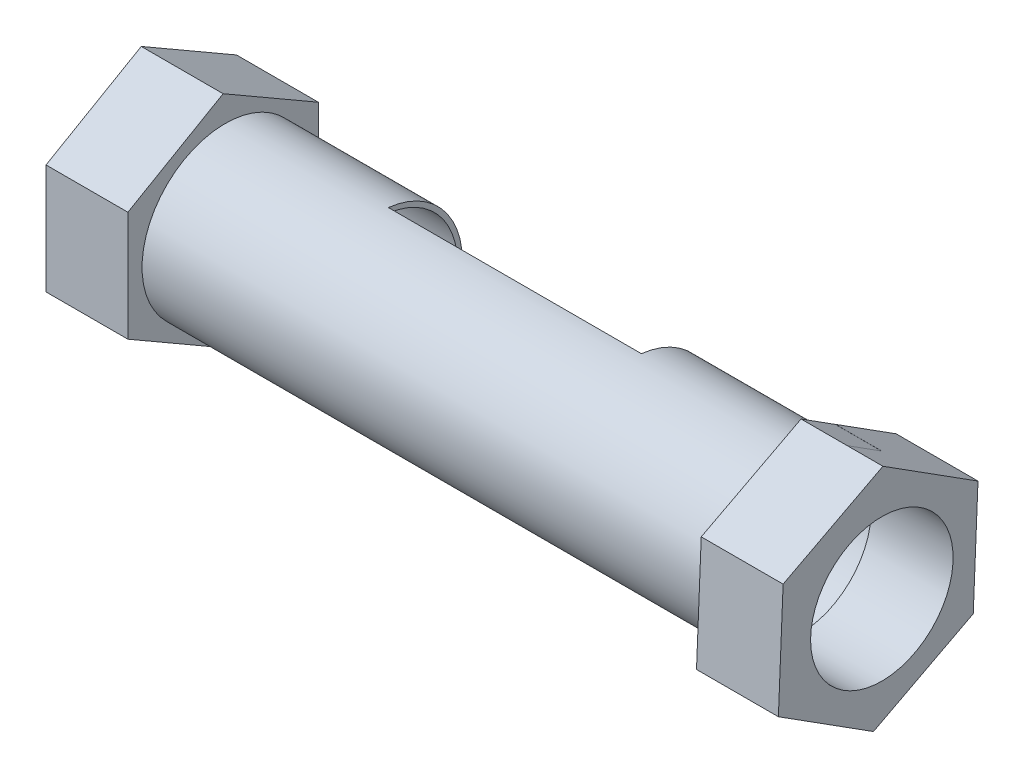
ISO-10303-21;
HEADER;
FILE_DESCRIPTION(('STEP AP214'),'2;1');
FILE_NAME('part.step','',(''),(''),'','','');
FILE_SCHEMA(('AUTOMOTIVE_DESIGN { 1 0 10303 214 1 1 1 1 }'));
ENDSEC;
DATA;
#1=APPLICATION_CONTEXT('core data for automotive mechanical design processes');
#2=APPLICATION_PROTOCOL_DEFINITION('international standard','automotive_design',2000,#1);
#3=PRODUCT_CONTEXT('',#1,'mechanical');
#4=PRODUCT('Part','Part','',(#3));
#5=PRODUCT_RELATED_PRODUCT_CATEGORY('part','',(#4));
#6=PRODUCT_DEFINITION_FORMATION('','',#4);
#7=PRODUCT_DEFINITION_CONTEXT('part definition',#1,'design');
#8=PRODUCT_DEFINITION('design','',#6,#7);
#9=PRODUCT_DEFINITION_SHAPE('','',#8);
#10=(LENGTH_UNIT() NAMED_UNIT(*) SI_UNIT(.MILLI.,.METRE.));
#11=(NAMED_UNIT(*) PLANE_ANGLE_UNIT() SI_UNIT($,.RADIAN.));
#12=(NAMED_UNIT(*) SI_UNIT($,.STERADIAN.) SOLID_ANGLE_UNIT());
#13=UNCERTAINTY_MEASURE_WITH_UNIT(LENGTH_MEASURE(1.E-05),#10,'distance_accuracy_value','');
#14=(GEOMETRIC_REPRESENTATION_CONTEXT(3) GLOBAL_UNCERTAINTY_ASSIGNED_CONTEXT((#13)) GLOBAL_UNIT_ASSIGNED_CONTEXT((#10,
#11,#12)) REPRESENTATION_CONTEXT('',''));
#15=CARTESIAN_POINT('',(0.,0.,0.));
#16=DIRECTION('',(0.,0.,1.));
#17=DIRECTION('',(1.,0.,0.));
#18=AXIS2_PLACEMENT_3D('',#15,#16,#17);
#19=CARTESIAN_POINT('',(400.,31.8499448364857,-60.9455307760078));
#20=DIRECTION('',(0.,-0.844247754451111,0.535953103456129));
#21=DIRECTION('',(0.,-0.535953103456129,-0.844247754451111));
#22=AXIS2_PLACEMENT_3D('',#19,#20,#21);
#23=PLANE('',#22);
#24=DIRECTION('',(0.,0.535953103456129,0.844247754451111));
#25=VECTOR('',#24,1.);
#26=CARTESIAN_POINT('',(350.,31.8499448364857,-60.9455307760078));
#27=LINE('',#26,#25);
#28=CARTESIAN_POINT('',(350.,31.8499448364857,-60.9455307760078));
#29=VERTEX_POINT('',#28);
#30=CARTESIAN_POINT('',(350.,55.3489186523933,-23.9293147152131));
#31=VERTEX_POINT('',#30);
#32=EDGE_CURVE('E285',#29,#31,#27,.T.);
#33=ORIENTED_EDGE('',*,*,#32,.T.);
#34=DIRECTION('',(1.,0.,0.));
#35=VECTOR('',#34,1.);
#36=CARTESIAN_POINT('',(400.,55.3489186523933,-23.9293147152131));
#37=LINE('',#36,#35);
#38=CARTESIAN_POINT('',(378.262248724972,55.3489186523933,-23.9293147152131));
#39=VERTEX_POINT('',#38);
#40=EDGE_CURVE('E186',#31,#39,#37,.T.);
#41=ORIENTED_EDGE('',*,*,#40,.T.);
#42=DIRECTION('',(0.,-0.535953103456129,-0.844247754451111));
#43=VECTOR('',#42,1.);
#44=CARTESIAN_POINT('',(378.262248724972,55.4173727829504,-23.8214839262261));
#45=LINE('',#44,#43);
#46=CARTESIAN_POINT('',(378.262248724972,68.7053503173919,-2.88990405047429));
#47=VERTEX_POINT('',#46);
#48=EDGE_CURVE('E180',#47,#39,#45,.T.);
#49=ORIENTED_EDGE('',*,*,#48,.F.);
#50=DIRECTION('',(-1.,0.,0.));
#51=VECTOR('',#50,1.);
#52=CARTESIAN_POINT('',(400.,68.7053503173919,-2.88990405047429));
#53=LINE('',#52,#51);
#54=CARTESIAN_POINT('',(400.,68.7053503173919,-2.88990405047429));
#55=VERTEX_POINT('',#54);
#56=EDGE_CURVE('E301',#55,#47,#53,.T.);
#57=ORIENTED_EDGE('',*,*,#56,.F.);
#58=DIRECTION('',(0.,0.535953103456129,0.844247754451111));
#59=VECTOR('',#58,1.);
#60=CARTESIAN_POINT('',(400.,31.8499448364857,-60.9455307760078));
#61=LINE('',#60,#59);
#62=CARTESIAN_POINT('',(400.,31.8499448364857,-60.9455307760078));
#63=VERTEX_POINT('',#62);
#64=EDGE_CURVE('E271',#63,#55,#61,.T.);
#65=ORIENTED_EDGE('',*,*,#64,.F.);
#66=DIRECTION('',(-1.,0.,0.));
#67=VECTOR('',#66,1.);
#68=CARTESIAN_POINT('',(400.,31.8499448364857,-60.9455307760078));
#69=LINE('',#68,#67);
#70=EDGE_CURVE('E304',#63,#29,#69,.T.);
#71=ORIENTED_EDGE('',*,*,#70,.T.);
#72=EDGE_LOOP('',(#33,#41,#49,#57,#65,#71));
#73=FACE_BOUND('',#72,.T.);
#74=ADVANCED_FACE('F34',(#73),#23,.F.);
#75=CARTESIAN_POINT('',(350.,0.,-1.28970231793346));
#76=DIRECTION('',(-1.,0.,0.));
#77=DIRECTION('',(0.,0.,1.));
#78=AXIS2_PLACEMENT_3D('',#75,#76,#77);
#79=CYLINDRICAL_SURFACE('',#78,50.8003751134074);
#80=DIRECTION('',(-1.,0.,0.));
#81=VECTOR('',#80,1.);
#82=CARTESIAN_POINT('',(350.,-50.4881730172019,-6.91309071355262));
#83=LINE('',#82,#81);
#84=CARTESIAN_POINT('',(93.9667928635855,-50.4881730172019,-6.91309071355262));
#85=VERTEX_POINT('',#84);
#86=CARTESIAN_POINT('',(248.52238004746,-50.4881730172019,-6.91309071355262));
#87=VERTEX_POINT('',#86);
#88=EDGE_CURVE('E198',#85,#87,#83,.F.);
#89=ORIENTED_EDGE('',*,*,#88,.T.);
#90=CARTESIAN_POINT('',(248.52238004746,0.,-1.28970231793346));
#91=DIRECTION('',(1.,0.,0.));
#92=DIRECTION('',(0.,0.,-1.));
#93=AXIS2_PLACEMENT_3D('',#90,#91,#92);
#94=CIRCLE('',#93,50.8003751134074);
#95=CARTESIAN_POINT('',(248.52238004746,50.4881730172019,-6.91309071355262));
#96=VERTEX_POINT('',#95);
#97=EDGE_CURVE('E204',#87,#96,#94,.T.);
#98=ORIENTED_EDGE('',*,*,#97,.T.);
#99=DIRECTION('',(-1.,0.,0.));
#100=VECTOR('',#99,1.);
#101=CARTESIAN_POINT('',(350.,50.4881730172019,-6.91309071355262));
#102=LINE('',#101,#100);
#103=CARTESIAN_POINT('',(93.9667928635855,50.4881730172019,-6.91309071355262));
#104=VERTEX_POINT('',#103);
#105=EDGE_CURVE('E201',#96,#104,#102,.T.);
#106=ORIENTED_EDGE('',*,*,#105,.T.);
#107=CARTESIAN_POINT('',(93.9667928635855,0.,-1.28970231793346));
#108=DIRECTION('',(-1.,0.,0.));
#109=DIRECTION('',(0.,0.,1.));
#110=AXIS2_PLACEMENT_3D('',#107,#108,#109);
#111=CIRCLE('',#110,50.8003751134074);
#112=EDGE_CURVE('E195',#104,#85,#111,.T.);
#113=ORIENTED_EDGE('',*,*,#112,.T.);
#114=EDGE_LOOP('',(#89,#98,#106,#113));
#115=FACE_BOUND('',#114,.T.);
#116=CARTESIAN_POINT('',(350.,0.,-1.28970231793346));
#117=DIRECTION('',(1.,0.,0.));
#118=DIRECTION('',(0.,0.,-1.));
#119=AXIS2_PLACEMENT_3D('',#116,#117,#118);
#120=CIRCLE('',#119,50.8003751134074);
#121=CARTESIAN_POINT('',(350.,0.,-52.0900774313409));
#122=VERTEX_POINT('',#121);
#123=EDGE_CURVE('E316',#122,#122,#120,.T.);
#124=ORIENTED_EDGE('',*,*,#123,.F.);
#125=EDGE_LOOP('',(#124));
#126=FACE_BOUND('',#125,.T.);
#127=CARTESIAN_POINT('',(0.,0.,-1.28970231793346));
#128=DIRECTION('',(1.,0.,0.));
#129=DIRECTION('',(0.,0.,-1.));
#130=AXIS2_PLACEMENT_3D('',#127,#128,#129);
#131=CIRCLE('',#130,50.8003751134074);
#132=CARTESIAN_POINT('',(0.,0.,-52.0900774313409));
#133=VERTEX_POINT('',#132);
#134=EDGE_CURVE('E264',#133,#133,#131,.T.);
#135=ORIENTED_EDGE('',*,*,#134,.T.);
#136=EDGE_LOOP('',(#135));
#137=FACE_BOUND('',#136,.T.);
#138=ADVANCED_FACE('F36',(#115,#126,#137),#79,.T.);
#139=CARTESIAN_POINT('',(350.,0.,-1.28970231793346));
#140=DIRECTION('',(-1.,0.,0.));
#141=DIRECTION('',(0.,0.,1.));
#142=AXIS2_PLACEMENT_3D('',#139,#140,#141);
#143=CYLINDRICAL_SURFACE('',#142,47.812951640793);
#144=CARTESIAN_POINT('',(248.52238004746,0.,-1.28970231793346));
#145=DIRECTION('',(1.,0.,0.));
#146=DIRECTION('',(0.,0.,-1.));
#147=AXIS2_PLACEMENT_3D('',#144,#145,#146);
#148=CIRCLE('',#147,47.812951640793);
#149=CARTESIAN_POINT('',(248.52238004746,-47.4811104288518,-6.91309071355262));
#150=VERTEX_POINT('',#149);
#151=CARTESIAN_POINT('',(248.52238004746,47.4811104288518,-6.91309071355262));
#152=VERTEX_POINT('',#151);
#153=EDGE_CURVE('E328',#150,#152,#148,.T.);
#154=ORIENTED_EDGE('',*,*,#153,.F.);
#155=DIRECTION('',(-1.,0.,0.));
#156=VECTOR('',#155,1.);
#157=CARTESIAN_POINT('',(350.,-47.4811104288518,-6.91309071355262));
#158=LINE('',#157,#156);
#159=CARTESIAN_POINT('',(93.9667928635855,-47.4811104288518,-6.91309071355262));
#160=VERTEX_POINT('',#159);
#161=EDGE_CURVE('E323',#160,#150,#158,.F.);
#162=ORIENTED_EDGE('',*,*,#161,.F.);
#163=CARTESIAN_POINT('',(93.9667928635855,0.,-1.28970231793346));
#164=DIRECTION('',(-1.,0.,0.));
#165=DIRECTION('',(0.,0.,1.));
#166=AXIS2_PLACEMENT_3D('',#163,#164,#165);
#167=CIRCLE('',#166,47.812951640793);
#168=CARTESIAN_POINT('',(93.9667928635855,47.4811104288518,-6.91309071355262));
#169=VERTEX_POINT('',#168);
#170=EDGE_CURVE('E319',#169,#160,#167,.T.);
#171=ORIENTED_EDGE('',*,*,#170,.F.);
#172=DIRECTION('',(-1.,0.,0.));
#173=VECTOR('',#172,1.);
#174=CARTESIAN_POINT('',(350.,47.4811104288518,-6.91309071355262));
#175=LINE('',#174,#173);
#176=EDGE_CURVE('E325',#152,#169,#175,.T.);
#177=ORIENTED_EDGE('',*,*,#176,.F.);
#178=EDGE_LOOP('',(#154,#162,#171,#177));
#179=FACE_BOUND('',#178,.T.);
#180=CARTESIAN_POINT('',(350.,0.,-1.28970231793346));
#181=DIRECTION('',(1.,0.,0.));
#182=DIRECTION('',(0.,0.,-1.));
#183=AXIS2_PLACEMENT_3D('',#180,#181,#182);
#184=CIRCLE('',#183,47.812951640793);
#185=CARTESIAN_POINT('',(350.,0.,-49.1026539587264));
#186=VERTEX_POINT('',#185);
#187=EDGE_CURVE('E310',#186,#186,#184,.T.);
#188=ORIENTED_EDGE('',*,*,#187,.T.);
#189=EDGE_LOOP('',(#188));
#190=FACE_BOUND('',#189,.T.);
#191=CARTESIAN_POINT('',(0.,0.,-1.28970231793346));
#192=DIRECTION('',(1.,0.,0.));
#193=DIRECTION('',(0.,0.,-1.));
#194=AXIS2_PLACEMENT_3D('',#191,#192,#193);
#195=CIRCLE('',#194,47.812951640793);
#196=CARTESIAN_POINT('',(0.,0.,-49.1026539587264));
#197=VERTEX_POINT('',#196);
#198=EDGE_CURVE('E313',#197,#197,#195,.T.);
#199=ORIENTED_EDGE('',*,*,#198,.F.);
#200=EDGE_LOOP('',(#199));
#201=FACE_BOUND('',#200,.T.);
#202=ADVANCED_FACE('F375',(#179,#190,#201),#143,.F.);
#203=CARTESIAN_POINT('',(350.,0.,0.));
#204=DIRECTION('',(1.,0.,0.));
#205=DIRECTION('',(0.,0.,-1.));
#206=AXIS2_PLACEMENT_3D('',#203,#204,#205);
#207=PLANE('',#206);
#208=CARTESIAN_POINT('',(350.,-1.09442531969695,-2.23147845243465));
#209=DIRECTION('',(-1.,0.,0.));
#210=DIRECTION('',(0.,0.,1.));
#211=AXIS2_PLACEMENT_3D('',#208,#209,#210);
#212=CIRCLE('',#211,43.5178984979552);
#213=CARTESIAN_POINT('',(350.,-1.09442531969695,41.2864200455205));
#214=VERTEX_POINT('',#213);
#215=EDGE_CURVE('E208',#214,#214,#212,.T.);
#216=ORIENTED_EDGE('',*,*,#215,.F.);
#217=EDGE_LOOP('',(#216));
#218=FACE_BOUND('',#217,.T.);
#219=ORIENTED_EDGE('',*,*,#187,.F.);
#220=EDGE_LOOP('',(#219));
#221=FACE_BOUND('',#220,.T.);
#222=ADVANCED_FACE('F369',(#218,#221),#207,.F.);
#223=CARTESIAN_POINT('',(400.,0.,0.));
#224=DIRECTION('',(1.,0.,0.));
#225=DIRECTION('',(0.,0.,-1.));
#226=AXIS2_PLACEMENT_3D('',#223,#224,#225);
#227=PLANE('',#226);
#228=CARTESIAN_POINT('',(400.,-1.09442531969695,-2.23147845243465));
#229=DIRECTION('',(-1.,0.,0.));
#230=DIRECTION('',(0.,0.,1.));
#231=AXIS2_PLACEMENT_3D('',#228,#229,#230);
#232=CIRCLE('',#231,43.5178984979552);
#233=CARTESIAN_POINT('',(400.,-1.09442531969695,41.2864200455205));
#234=VERTEX_POINT('',#233);
#235=EDGE_CURVE('E209',#234,#234,#232,.T.);
#236=ORIENTED_EDGE('',*,*,#235,.T.);
#237=EDGE_LOOP('',(#236));
#238=FACE_BOUND('',#237,.T.);
#239=DIRECTION('',(0.,0.463163450714565,-0.886272880055673));
#240=VECTOR('',#239,1.);
#241=CARTESIAN_POINT('',(400.,-68.7053503173919,2.88990405047424));
#242=LINE('',#241,#240);
#243=CARTESIAN_POINT('',(400.,-68.7053503173919,2.88990405047424));
#244=VERTEX_POINT('',#243);
#245=CARTESIAN_POINT('',(400.,-36.8554054809062,-58.0556267255335));
#246=VERTEX_POINT('',#245);
#247=EDGE_CURVE('E265',#244,#246,#242,.T.);
#248=ORIENTED_EDGE('',*,*,#247,.T.);
#249=DIRECTION('',(0.,0.999116554170694,-0.0420251256045614));
#250=VECTOR('',#249,1.);
#251=CARTESIAN_POINT('',(400.,-36.8554054809062,-58.0556267255335));
#252=LINE('',#251,#250);
#253=EDGE_CURVE('E268',#246,#63,#252,.T.);
#254=ORIENTED_EDGE('',*,*,#253,.T.);
#255=ORIENTED_EDGE('',*,*,#64,.T.);
#256=DIRECTION('',(0.,-0.463163450714565,0.886272880055673));
#257=VECTOR('',#256,1.);
#258=CARTESIAN_POINT('',(400.,68.7053503173919,-2.88990405047429));
#259=LINE('',#258,#257);
#260=CARTESIAN_POINT('',(400.,36.8554054809062,58.0556267255335));
#261=VERTEX_POINT('',#260);
#262=EDGE_CURVE('E273',#55,#261,#259,.T.);
#263=ORIENTED_EDGE('',*,*,#262,.T.);
#264=DIRECTION('',(0.,-0.999116554170694,0.0420251256045615));
#265=VECTOR('',#264,1.);
#266=CARTESIAN_POINT('',(400.,36.8554054809062,58.0556267255335));
#267=LINE('',#266,#265);
#268=CARTESIAN_POINT('',(400.,-31.8499448364857,60.9455307760078));
#269=VERTEX_POINT('',#268);
#270=EDGE_CURVE('E275',#261,#269,#267,.T.);
#271=ORIENTED_EDGE('',*,*,#270,.T.);
#272=DIRECTION('',(0.,-0.535953103456129,-0.844247754451111));
#273=VECTOR('',#272,1.);
#274=CARTESIAN_POINT('',(400.,-31.8499448364857,60.9455307760078));
#275=LINE('',#274,#273);
#276=EDGE_CURVE('E277',#269,#244,#275,.T.);
#277=ORIENTED_EDGE('',*,*,#276,.T.);
#278=EDGE_LOOP('',(#248,#254,#255,#263,#271,#277));
#279=FACE_BOUND('',#278,.T.);
#280=ADVANCED_FACE('F348',(#238,#279),#227,.T.);
#281=ORIENTED_EDGE('',*,*,#123,.T.);
#282=EDGE_LOOP('',(#281));
#283=FACE_BOUND('',#282,.T.);
#284=DIRECTION('',(0.,-0.537261503485051,-0.843415720076987));
#285=VECTOR('',#284,1.);
#286=CARTESIAN_POINT('',(350.,50.1811219008985,-31.9657131794774));
#287=LINE('',#286,#285);
#288=CARTESIAN_POINT('',(350.,68.7041146509274,-2.88753957703715));
#289=VERTEX_POINT('',#288);
#290=CARTESIAN_POINT('',(350.,55.3160398553878,-23.9047028594959));
#291=VERTEX_POINT('',#290);
#292=EDGE_CURVE('E184',#289,#291,#287,.T.);
#293=ORIENTED_EDGE('',*,*,#292,.T.);
#294=DIRECTION('',(0.,0.800551793849256,-0.599263569195341));
#295=VECTOR('',#294,1.);
#296=CARTESIAN_POINT('',(350.,8.39684201277107,11.2172794769066));
#297=LINE('',#296,#295);
#298=EDGE_CURVE('E11',#291,#31,#297,.T.);
#299=ORIENTED_EDGE('',*,*,#298,.T.);
#300=ORIENTED_EDGE('',*,*,#32,.F.);
#301=DIRECTION('',(0.,0.999116554170694,-0.0420251256045614));
#302=VECTOR('',#301,1.);
#303=CARTESIAN_POINT('',(350.,-36.8554054809062,-58.0556267255335));
#304=LINE('',#303,#302);
#305=CARTESIAN_POINT('',(350.,-36.8554054809062,-58.0556267255335));
#306=VERTEX_POINT('',#305);
#307=EDGE_CURVE('E283',#306,#29,#304,.T.);
#308=ORIENTED_EDGE('',*,*,#307,.F.);
#309=DIRECTION('',(0.,0.463163450714565,-0.886272880055673));
#310=VECTOR('',#309,1.);
#311=CARTESIAN_POINT('',(350.,-68.7053503173919,2.88990405047424));
#312=LINE('',#311,#310);
#313=CARTESIAN_POINT('',(350.,-68.7053503173919,2.88990405047424));
#314=VERTEX_POINT('',#313);
#315=EDGE_CURVE('E280',#314,#306,#312,.T.);
#316=ORIENTED_EDGE('',*,*,#315,.F.);
#317=DIRECTION('',(0.,-0.535953103456129,-0.844247754451111));
#318=VECTOR('',#317,1.);
#319=CARTESIAN_POINT('',(350.,-31.8499448364857,60.9455307760078));
#320=LINE('',#319,#318);
#321=CARTESIAN_POINT('',(350.,-31.8499448364857,60.9455307760078));
#322=VERTEX_POINT('',#321);
#323=EDGE_CURVE('E269',#322,#314,#320,.T.);
#324=ORIENTED_EDGE('',*,*,#323,.F.);
#325=DIRECTION('',(0.,-0.999116554170694,0.0420251256045615));
#326=VECTOR('',#325,1.);
#327=CARTESIAN_POINT('',(350.,36.8554054809062,58.0556267255335));
#328=LINE('',#327,#326);
#329=CARTESIAN_POINT('',(350.,36.8554054809062,58.0556267255335));
#330=VERTEX_POINT('',#329);
#331=EDGE_CURVE('E290',#330,#322,#328,.T.);
#332=ORIENTED_EDGE('',*,*,#331,.F.);
#333=DIRECTION('',(0.,-0.463163450714565,0.886272880055673));
#334=VECTOR('',#333,1.);
#335=CARTESIAN_POINT('',(350.,68.7053503173919,-2.88990405047429));
#336=LINE('',#335,#334);
#337=EDGE_CURVE('E288',#289,#330,#336,.T.);
#338=ORIENTED_EDGE('',*,*,#337,.F.);
#339=EDGE_LOOP('',(#293,#299,#300,#308,#316,#324,#332,#338));
#340=FACE_BOUND('',#339,.T.);
#341=ADVANCED_FACE('F335',(#283,#340),#207,.F.);
#342=CARTESIAN_POINT('',(400.,-68.7053503173919,2.88990405047424));
#343=DIRECTION('',(0.,0.886272880055673,0.463163450714565));
#344=DIRECTION('',(0.,-0.463163450714565,0.886272880055673));
#345=AXIS2_PLACEMENT_3D('',#342,#343,#344);
#346=PLANE('',#345);
#347=ORIENTED_EDGE('',*,*,#315,.T.);
#348=DIRECTION('',(-1.,0.,0.));
#349=VECTOR('',#348,1.);
#350=CARTESIAN_POINT('',(400.,-36.8554054809062,-58.0556267255335));
#351=LINE('',#350,#349);
#352=EDGE_CURVE('E307',#246,#306,#351,.T.);
#353=ORIENTED_EDGE('',*,*,#352,.F.);
#354=ORIENTED_EDGE('',*,*,#247,.F.);
#355=DIRECTION('',(-1.,0.,0.));
#356=VECTOR('',#355,1.);
#357=CARTESIAN_POINT('',(400.,-68.7053503173919,2.88990405047424));
#358=LINE('',#357,#356);
#359=EDGE_CURVE('E279',#244,#314,#358,.T.);
#360=ORIENTED_EDGE('',*,*,#359,.T.);
#361=EDGE_LOOP('',(#347,#353,#354,#360));
#362=FACE_BOUND('',#361,.T.);
#363=ADVANCED_FACE('F359',(#362),#346,.F.);
#364=CARTESIAN_POINT('',(400.,-36.8554054809062,-58.0556267255335));
#365=DIRECTION('',(0.,0.0420251256045614,0.999116554170694));
#366=DIRECTION('',(0.,-0.999116554170694,0.0420251256045614));
#367=AXIS2_PLACEMENT_3D('',#364,#365,#366);
#368=PLANE('',#367);
#369=ORIENTED_EDGE('',*,*,#307,.T.);
#370=ORIENTED_EDGE('',*,*,#70,.F.);
#371=ORIENTED_EDGE('',*,*,#253,.F.);
#372=ORIENTED_EDGE('',*,*,#352,.T.);
#373=EDGE_LOOP('',(#369,#370,#371,#372));
#374=FACE_BOUND('',#373,.T.);
#375=ADVANCED_FACE('F357',(#374),#368,.F.);
#376=CARTESIAN_POINT('',(400.,68.7053503173919,-2.88990405047429));
#377=DIRECTION('',(0.,-0.886272880055673,-0.463163450714565));
#378=DIRECTION('',(0.,0.463163450714565,-0.886272880055673));
#379=AXIS2_PLACEMENT_3D('',#376,#377,#378);
#380=PLANE('',#379);
#381=DIRECTION('',(0.,-0.463163450714565,0.886272880055673));
#382=VECTOR('',#381,1.);
#383=CARTESIAN_POINT('',(378.262248724972,68.7053503173919,-2.88990405047429));
#384=LINE('',#383,#382);
#385=CARTESIAN_POINT('',(378.262248724972,68.7041146509274,-2.88753957703715));
#386=VERTEX_POINT('',#385);
#387=EDGE_CURVE('E173',#47,#386,#384,.T.);
#388=ORIENTED_EDGE('',*,*,#387,.T.);
#389=DIRECTION('',(-1.,0.,0.));
#390=VECTOR('',#389,1.);
#391=CARTESIAN_POINT('',(400.,68.7041146509274,-2.88753957703715));
#392=LINE('',#391,#390);
#393=EDGE_CURVE('E42',#386,#289,#392,.T.);
#394=ORIENTED_EDGE('',*,*,#393,.T.);
#395=ORIENTED_EDGE('',*,*,#337,.T.);
#396=DIRECTION('',(-1.,0.,0.));
#397=VECTOR('',#396,1.);
#398=CARTESIAN_POINT('',(400.,36.8554054809062,58.0556267255335));
#399=LINE('',#398,#397);
#400=EDGE_CURVE('E298',#261,#330,#399,.T.);
#401=ORIENTED_EDGE('',*,*,#400,.F.);
#402=ORIENTED_EDGE('',*,*,#262,.F.);
#403=ORIENTED_EDGE('',*,*,#56,.T.);
#404=EDGE_LOOP('',(#388,#394,#395,#401,#402,#403));
#405=FACE_BOUND('',#404,.T.);
#406=ADVANCED_FACE('F331',(#405),#380,.F.);
#407=CARTESIAN_POINT('',(400.,36.8554054809062,58.0556267255335));
#408=DIRECTION('',(0.,-0.0420251256045615,-0.999116554170694));
#409=DIRECTION('',(0.,0.999116554170694,-0.0420251256045615));
#410=AXIS2_PLACEMENT_3D('',#407,#408,#409);
#411=PLANE('',#410);
#412=ORIENTED_EDGE('',*,*,#331,.T.);
#413=DIRECTION('',(-1.,0.,0.));
#414=VECTOR('',#413,1.);
#415=CARTESIAN_POINT('',(400.,-31.8499448364857,60.9455307760078));
#416=LINE('',#415,#414);
#417=EDGE_CURVE('E295',#269,#322,#416,.T.);
#418=ORIENTED_EDGE('',*,*,#417,.F.);
#419=ORIENTED_EDGE('',*,*,#270,.F.);
#420=ORIENTED_EDGE('',*,*,#400,.T.);
#421=EDGE_LOOP('',(#412,#418,#419,#420));
#422=FACE_BOUND('',#421,.T.);
#423=ADVANCED_FACE('F340',(#422),#411,.F.);
#424=CARTESIAN_POINT('',(400.,-31.8499448364857,60.9455307760078));
#425=DIRECTION('',(0.,0.844247754451111,-0.535953103456129));
#426=DIRECTION('',(0.,0.535953103456129,0.844247754451111));
#427=AXIS2_PLACEMENT_3D('',#424,#425,#426);
#428=PLANE('',#427);
#429=ORIENTED_EDGE('',*,*,#323,.T.);
#430=ORIENTED_EDGE('',*,*,#359,.F.);
#431=ORIENTED_EDGE('',*,*,#276,.F.);
#432=ORIENTED_EDGE('',*,*,#417,.T.);
#433=EDGE_LOOP('',(#429,#430,#431,#432));
#434=FACE_BOUND('',#433,.T.);
#435=ADVANCED_FACE('F344',(#434),#428,.F.);
#436=CARTESIAN_POINT('',(0.,0.,0.));
#437=DIRECTION('',(-1.,0.,0.));
#438=DIRECTION('',(0.,0.,1.));
#439=AXIS2_PLACEMENT_3D('',#436,#437,#438);
#440=PLANE('',#439);
#441=CARTESIAN_POINT('',(0.,0.,-2.16727803402694));
#442=DIRECTION('',(1.,0.,0.));
#443=DIRECTION('',(0.,0.,-1.));
#444=AXIS2_PLACEMENT_3D('',#441,#442,#443);
#445=CIRCLE('',#444,44.9963180306759);
#446=CARTESIAN_POINT('',(0.,0.,-47.1635960647028));
#447=VERTEX_POINT('',#446);
#448=EDGE_CURVE('E212',#447,#447,#445,.T.);
#449=ORIENTED_EDGE('',*,*,#448,.F.);
#450=EDGE_LOOP('',(#449));
#451=FACE_BOUND('',#450,.T.);
#452=ORIENTED_EDGE('',*,*,#198,.T.);
#453=EDGE_LOOP('',(#452));
#454=FACE_BOUND('',#453,.T.);
#455=ADVANCED_FACE('F383',(#451,#454),#440,.F.);
#456=CARTESIAN_POINT('',(-50.,-33.5806765082707,-58.1634378648579));
#457=DIRECTION('',(0.,0.866025403784442,0.499999999999995));
#458=DIRECTION('',(0.,-0.499999999999995,0.866025403784442));
#459=AXIS2_PLACEMENT_3D('',#456,#457,#458);
#460=PLANE('',#459);
#461=DIRECTION('',(0.,-0.499999999999995,0.866025403784442));
#462=VECTOR('',#461,1.);
#463=CARTESIAN_POINT('',(0.,-33.5806765082707,-58.1634378648579));
#464=LINE('',#463,#462);
#465=CARTESIAN_POINT('',(0.,-33.5806765082707,-58.1634378648579));
#466=VERTEX_POINT('',#465);
#467=CARTESIAN_POINT('',(0.,-67.16135301654,0.));
#468=VERTEX_POINT('',#467);
#469=EDGE_CURVE('E218',#466,#468,#464,.T.);
#470=ORIENTED_EDGE('',*,*,#469,.T.);
#471=DIRECTION('',(1.,0.,0.));
#472=VECTOR('',#471,1.);
#473=CARTESIAN_POINT('',(-50.,-67.16135301654,0.));
#474=LINE('',#473,#472);
#475=CARTESIAN_POINT('',(-50.,-67.16135301654,0.));
#476=VERTEX_POINT('',#475);
#477=EDGE_CURVE('E261',#476,#468,#474,.T.);
#478=ORIENTED_EDGE('',*,*,#477,.F.);
#479=DIRECTION('',(0.,-0.499999999999995,0.866025403784442));
#480=VECTOR('',#479,1.);
#481=CARTESIAN_POINT('',(-50.,-33.5806765082707,-58.1634378648579));
#482=LINE('',#481,#480);
#483=CARTESIAN_POINT('',(-50.,-33.5806765082707,-58.1634378648579));
#484=VERTEX_POINT('',#483);
#485=EDGE_CURVE('E221',#484,#476,#482,.T.);
#486=ORIENTED_EDGE('',*,*,#485,.F.);
#487=DIRECTION('',(1.,0.,0.));
#488=VECTOR('',#487,1.);
#489=CARTESIAN_POINT('',(-50.,-33.5806765082707,-58.1634378648579));
#490=LINE('',#489,#488);
#491=EDGE_CURVE('E235',#484,#466,#490,.T.);
#492=ORIENTED_EDGE('',*,*,#491,.T.);
#493=EDGE_LOOP('',(#470,#478,#486,#492));
#494=FACE_BOUND('',#493,.T.);
#495=ADVANCED_FACE('F388',(#494),#460,.F.);
#496=CARTESIAN_POINT('',(-50.,-67.16135301654,0.));
#497=DIRECTION('',(0.,0.866025403784438,-0.500000000000001));
#498=DIRECTION('',(0.,0.500000000000001,0.866025403784438));
#499=AXIS2_PLACEMENT_3D('',#496,#497,#498);
#500=PLANE('',#499);
#501=DIRECTION('',(0.,0.500000000000001,0.866025403784438));
#502=VECTOR('',#501,1.);
#503=CARTESIAN_POINT('',(0.,-67.16135301654,0.));
#504=LINE('',#503,#502);
#505=CARTESIAN_POINT('',(0.,-33.5806765082699,58.1634378648584));
#506=VERTEX_POINT('',#505);
#507=EDGE_CURVE('E238',#468,#506,#504,.T.);
#508=ORIENTED_EDGE('',*,*,#507,.T.);
#509=DIRECTION('',(1.,0.,0.));
#510=VECTOR('',#509,1.);
#511=CARTESIAN_POINT('',(-50.,-33.5806765082699,58.1634378648584));
#512=LINE('',#511,#510);
#513=CARTESIAN_POINT('',(-50.,-33.5806765082699,58.1634378648584));
#514=VERTEX_POINT('',#513);
#515=EDGE_CURVE('E258',#514,#506,#512,.T.);
#516=ORIENTED_EDGE('',*,*,#515,.F.);
#517=DIRECTION('',(0.,0.500000000000001,0.866025403784438));
#518=VECTOR('',#517,1.);
#519=CARTESIAN_POINT('',(-50.,-67.16135301654,0.));
#520=LINE('',#519,#518);
#521=EDGE_CURVE('E224',#476,#514,#520,.T.);
#522=ORIENTED_EDGE('',*,*,#521,.F.);
#523=ORIENTED_EDGE('',*,*,#477,.T.);
#524=EDGE_LOOP('',(#508,#516,#522,#523));
#525=FACE_BOUND('',#524,.T.);
#526=ADVANCED_FACE('F391',(#525),#500,.F.);
#527=CARTESIAN_POINT('',(-50.,-33.5806765082699,58.1634378648584));
#528=DIRECTION('',(0.,0.,-1.));
#529=DIRECTION('',(0.,1.,0.));
#530=AXIS2_PLACEMENT_3D('',#527,#528,#529);
#531=PLANE('',#530);
#532=DIRECTION('',(0.,1.,0.));
#533=VECTOR('',#532,1.);
#534=CARTESIAN_POINT('',(0.,-33.5806765082699,58.1634378648584));
#535=LINE('',#534,#533);
#536=CARTESIAN_POINT('',(0.,33.5806765082703,58.1634378648581));
#537=VERTEX_POINT('',#536);
#538=EDGE_CURVE('E240',#506,#537,#535,.T.);
#539=ORIENTED_EDGE('',*,*,#538,.T.);
#540=DIRECTION('',(1.,0.,0.));
#541=VECTOR('',#540,1.);
#542=CARTESIAN_POINT('',(-50.,33.5806765082703,58.1634378648581));
#543=LINE('',#542,#541);
#544=CARTESIAN_POINT('',(-50.,33.5806765082703,58.1634378648581));
#545=VERTEX_POINT('',#544);
#546=EDGE_CURVE('E255',#545,#537,#543,.T.);
#547=ORIENTED_EDGE('',*,*,#546,.F.);
#548=DIRECTION('',(0.,1.,0.));
#549=VECTOR('',#548,1.);
#550=CARTESIAN_POINT('',(-50.,-33.5806765082699,58.1634378648584));
#551=LINE('',#550,#549);
#552=EDGE_CURVE('E227',#514,#545,#551,.T.);
#553=ORIENTED_EDGE('',*,*,#552,.F.);
#554=ORIENTED_EDGE('',*,*,#515,.T.);
#555=EDGE_LOOP('',(#539,#547,#553,#554));
#556=FACE_BOUND('',#555,.T.);
#557=ADVANCED_FACE('F395',(#556),#531,.F.);
#558=CARTESIAN_POINT('',(-50.,33.5806765082703,58.1634378648581));
#559=DIRECTION('',(0.,-0.866025403784442,-0.499999999999995));
#560=DIRECTION('',(0.,0.499999999999995,-0.866025403784442));
#561=AXIS2_PLACEMENT_3D('',#558,#559,#560);
#562=PLANE('',#561);
#563=DIRECTION('',(0.,0.499999999999995,-0.866025403784442));
#564=VECTOR('',#563,1.);
#565=CARTESIAN_POINT('',(0.,33.5806765082703,58.1634378648581));
#566=LINE('',#565,#564);
#567=CARTESIAN_POINT('',(0.,67.16135301654,-4.68985221497411E-13));
#568=VERTEX_POINT('',#567);
#569=EDGE_CURVE('E242',#537,#568,#566,.T.);
#570=ORIENTED_EDGE('',*,*,#569,.T.);
#571=DIRECTION('',(1.,0.,0.));
#572=VECTOR('',#571,1.);
#573=CARTESIAN_POINT('',(-50.,67.16135301654,-4.68985221497411E-13));
#574=LINE('',#573,#572);
#575=CARTESIAN_POINT('',(-50.,67.16135301654,-4.68985221497411E-13));
#576=VERTEX_POINT('',#575);
#577=EDGE_CURVE('E252',#576,#568,#574,.T.);
#578=ORIENTED_EDGE('',*,*,#577,.F.);
#579=DIRECTION('',(0.,0.499999999999995,-0.866025403784442));
#580=VECTOR('',#579,1.);
#581=CARTESIAN_POINT('',(-50.,33.5806765082703,58.1634378648581));
#582=LINE('',#581,#580);
#583=EDGE_CURVE('E229',#545,#576,#582,.T.);
#584=ORIENTED_EDGE('',*,*,#583,.F.);
#585=ORIENTED_EDGE('',*,*,#546,.T.);
#586=EDGE_LOOP('',(#570,#578,#584,#585));
#587=FACE_BOUND('',#586,.T.);
#588=ADVANCED_FACE('F399',(#587),#562,.F.);
#589=CARTESIAN_POINT('',(-50.,67.16135301654,-4.68985221497411E-13));
#590=DIRECTION('',(0.,-0.866025403784435,0.500000000000007));
#591=DIRECTION('',(0.,-0.500000000000007,-0.866025403784435));
#592=AXIS2_PLACEMENT_3D('',#589,#590,#591);
#593=PLANE('',#592);
#594=DIRECTION('',(0.,-0.500000000000007,-0.866025403784435));
#595=VECTOR('',#594,1.);
#596=CARTESIAN_POINT('',(0.,67.16135301654,-4.68985221497411E-13));
#597=LINE('',#596,#595);
#598=CARTESIAN_POINT('',(0.,33.5806765082695,-58.1634378648586));
#599=VERTEX_POINT('',#598);
#600=EDGE_CURVE('E244',#568,#599,#597,.T.);
#601=ORIENTED_EDGE('',*,*,#600,.T.);
#602=DIRECTION('',(1.,0.,0.));
#603=VECTOR('',#602,1.);
#604=CARTESIAN_POINT('',(-50.,33.5806765082695,-58.1634378648586));
#605=LINE('',#604,#603);
#606=CARTESIAN_POINT('',(-50.,33.5806765082695,-58.1634378648586));
#607=VERTEX_POINT('',#606);
#608=EDGE_CURVE('E249',#607,#599,#605,.T.);
#609=ORIENTED_EDGE('',*,*,#608,.F.);
#610=DIRECTION('',(0.,-0.500000000000007,-0.866025403784435));
#611=VECTOR('',#610,1.);
#612=CARTESIAN_POINT('',(-50.,67.16135301654,-4.68985221497411E-13));
#613=LINE('',#612,#611);
#614=EDGE_CURVE('E231',#576,#607,#613,.T.);
#615=ORIENTED_EDGE('',*,*,#614,.F.);
#616=ORIENTED_EDGE('',*,*,#577,.T.);
#617=EDGE_LOOP('',(#601,#609,#615,#616));
#618=FACE_BOUND('',#617,.T.);
#619=ADVANCED_FACE('F403',(#618),#593,.F.);
#620=CARTESIAN_POINT('',(-50.,33.5806765082695,-58.1634378648586));
#621=DIRECTION('',(0.,0.,1.));
#622=DIRECTION('',(0.,-1.,0.));
#623=AXIS2_PLACEMENT_3D('',#620,#621,#622);
#624=PLANE('',#623);
#625=DIRECTION('',(0.,-1.,0.));
#626=VECTOR('',#625,1.);
#627=CARTESIAN_POINT('',(0.,33.5806765082695,-58.1634378648586));
#628=LINE('',#627,#626);
#629=EDGE_CURVE('E225',#599,#466,#628,.T.);
#630=ORIENTED_EDGE('',*,*,#629,.T.);
#631=ORIENTED_EDGE('',*,*,#491,.F.);
#632=DIRECTION('',(0.,-1.,0.));
#633=VECTOR('',#632,1.);
#634=CARTESIAN_POINT('',(-50.,33.5806765082695,-58.1634378648586));
#635=LINE('',#634,#633);
#636=EDGE_CURVE('E233',#607,#484,#635,.T.);
#637=ORIENTED_EDGE('',*,*,#636,.F.);
#638=ORIENTED_EDGE('',*,*,#608,.T.);
#639=EDGE_LOOP('',(#630,#631,#637,#638));
#640=FACE_BOUND('',#639,.T.);
#641=ADVANCED_FACE('F407',(#640),#624,.F.);
#642=CARTESIAN_POINT('',(-50.,0.,0.));
#643=DIRECTION('',(-1.,0.,0.));
#644=DIRECTION('',(0.,0.,1.));
#645=AXIS2_PLACEMENT_3D('',#642,#643,#644);
#646=PLANE('',#645);
#647=CARTESIAN_POINT('',(-50.,0.,-2.16727803402694));
#648=DIRECTION('',(1.,0.,0.));
#649=DIRECTION('',(0.,0.,-1.));
#650=AXIS2_PLACEMENT_3D('',#647,#648,#649);
#651=CIRCLE('',#650,44.9963180306759);
#652=CARTESIAN_POINT('',(-50.,0.,-47.1635960647028));
#653=VERTEX_POINT('',#652);
#654=EDGE_CURVE('E215',#653,#653,#651,.T.);
#655=ORIENTED_EDGE('',*,*,#654,.T.);
#656=EDGE_LOOP('',(#655));
#657=FACE_BOUND('',#656,.T.);
#658=ORIENTED_EDGE('',*,*,#485,.T.);
#659=ORIENTED_EDGE('',*,*,#521,.T.);
#660=ORIENTED_EDGE('',*,*,#552,.T.);
#661=ORIENTED_EDGE('',*,*,#583,.T.);
#662=ORIENTED_EDGE('',*,*,#614,.T.);
#663=ORIENTED_EDGE('',*,*,#636,.T.);
#664=EDGE_LOOP('',(#658,#659,#660,#661,#662,#663));
#665=FACE_BOUND('',#664,.T.);
#666=ADVANCED_FACE('F411',(#657,#665),#646,.T.);
#667=ORIENTED_EDGE('',*,*,#134,.F.);
#668=EDGE_LOOP('',(#667));
#669=FACE_BOUND('',#668,.T.);
#670=ORIENTED_EDGE('',*,*,#469,.F.);
#671=ORIENTED_EDGE('',*,*,#629,.F.);
#672=ORIENTED_EDGE('',*,*,#600,.F.);
#673=ORIENTED_EDGE('',*,*,#569,.F.);
#674=ORIENTED_EDGE('',*,*,#538,.F.);
#675=ORIENTED_EDGE('',*,*,#507,.F.);
#676=EDGE_LOOP('',(#670,#671,#672,#673,#674,#675));
#677=FACE_BOUND('',#676,.T.);
#678=ADVANCED_FACE('F413',(#669,#677),#440,.F.);
#679=CARTESIAN_POINT('',(-50.,0.,-2.16727803402694));
#680=DIRECTION('',(1.,0.,0.));
#681=DIRECTION('',(0.,0.,-1.));
#682=AXIS2_PLACEMENT_3D('',#679,#680,#681);
#683=CYLINDRICAL_SURFACE('',#682,44.9963180306759);
#684=ORIENTED_EDGE('',*,*,#654,.F.);
#685=EDGE_LOOP('',(#684));
#686=FACE_BOUND('',#685,.T.);
#687=ORIENTED_EDGE('',*,*,#448,.T.);
#688=EDGE_LOOP('',(#687));
#689=FACE_BOUND('',#688,.T.);
#690=ADVANCED_FACE('F416',(#686,#689),#683,.F.);
#691=CARTESIAN_POINT('',(400.,-1.09442531969695,-2.23147845243465));
#692=DIRECTION('',(-1.,0.,0.));
#693=DIRECTION('',(0.,0.,1.));
#694=AXIS2_PLACEMENT_3D('',#691,#692,#693);
#695=CYLINDRICAL_SURFACE('',#694,43.5178984979552);
#696=ORIENTED_EDGE('',*,*,#235,.F.);
#697=EDGE_LOOP('',(#696));
#698=FACE_BOUND('',#697,.T.);
#699=ORIENTED_EDGE('',*,*,#215,.T.);
#700=EDGE_LOOP('',(#699));
#701=FACE_BOUND('',#700,.T.);
#702=ADVANCED_FACE('F423',(#698,#701),#695,.F.);
#703=CARTESIAN_POINT('',(248.52238004746,-68.7053503173919,-6.91309071355262));
#704=DIRECTION('',(1.,0.,0.));
#705=DIRECTION('',(0.,0.,-1.));
#706=AXIS2_PLACEMENT_3D('',#703,#704,#705);
#707=PLANE('',#706);
#708=DIRECTION('',(0.,1.,0.));
#709=VECTOR('',#708,1.);
#710=CARTESIAN_POINT('',(248.52238004746,-68.7053503173919,-6.91309071355262));
#711=LINE('',#710,#709);
#712=EDGE_CURVE('E192',#87,#150,#711,.T.);
#713=ORIENTED_EDGE('',*,*,#712,.T.);
#714=ORIENTED_EDGE('',*,*,#153,.T.);
#715=EDGE_CURVE('E189',#152,#96,#711,.T.);
#716=ORIENTED_EDGE('',*,*,#715,.T.);
#717=ORIENTED_EDGE('',*,*,#97,.F.);
#718=EDGE_LOOP('',(#713,#714,#716,#717));
#719=FACE_BOUND('',#718,.T.);
#720=ADVANCED_FACE('F427',(#719),#707,.F.);
#721=CARTESIAN_POINT('',(248.52238004746,-68.7053503173919,-6.91309071355262));
#722=DIRECTION('',(0.,0.,1.));
#723=DIRECTION('',(1.,0.,0.));
#724=AXIS2_PLACEMENT_3D('',#721,#722,#723);
#725=PLANE('',#724);
#726=ORIENTED_EDGE('',*,*,#715,.F.);
#727=ORIENTED_EDGE('',*,*,#176,.T.);
#728=DIRECTION('',(0.,1.,0.));
#729=VECTOR('',#728,1.);
#730=CARTESIAN_POINT('',(93.9667928635855,-68.7053503173919,-6.91309071355262));
#731=LINE('',#730,#729);
#732=EDGE_CURVE('E188',#169,#104,#731,.T.);
#733=ORIENTED_EDGE('',*,*,#732,.T.);
#734=ORIENTED_EDGE('',*,*,#105,.F.);
#735=EDGE_LOOP('',(#726,#727,#733,#734));
#736=FACE_BOUND('',#735,.T.);
#737=ADVANCED_FACE('F431',(#736),#725,.F.);
#738=EDGE_CURVE('E57',#85,#160,#731,.T.);
#739=ORIENTED_EDGE('',*,*,#738,.T.);
#740=ORIENTED_EDGE('',*,*,#161,.T.);
#741=ORIENTED_EDGE('',*,*,#712,.F.);
#742=ORIENTED_EDGE('',*,*,#88,.F.);
#743=EDGE_LOOP('',(#739,#740,#741,#742));
#744=FACE_BOUND('',#743,.T.);
#745=ADVANCED_FACE('F436',(#744),#725,.F.);
#746=CARTESIAN_POINT('',(93.9667928635855,-68.7053503173919,-6.91309071355262));
#747=DIRECTION('',(-1.,0.,0.));
#748=DIRECTION('',(0.,0.,1.));
#749=AXIS2_PLACEMENT_3D('',#746,#747,#748);
#750=PLANE('',#749);
#751=ORIENTED_EDGE('',*,*,#732,.F.);
#752=ORIENTED_EDGE('',*,*,#170,.T.);
#753=ORIENTED_EDGE('',*,*,#738,.F.);
#754=ORIENTED_EDGE('',*,*,#112,.F.);
#755=EDGE_LOOP('',(#751,#752,#753,#754));
#756=FACE_BOUND('',#755,.T.);
#757=ADVANCED_FACE('F433',(#756),#750,.F.);
#758=CARTESIAN_POINT('',(328.262248724972,94.3537701734485,-53.1269090720414));
#759=DIRECTION('',(0.,-0.599263569195341,-0.800551793849256));
#760=DIRECTION('',(0.,0.800551793849256,-0.599263569195341));
#761=AXIS2_PLACEMENT_3D('',#758,#759,#760);
#762=PLANE('',#761);
#763=ORIENTED_EDGE('',*,*,#298,.F.);
#764=DIRECTION('',(1.,0.,0.));
#765=VECTOR('',#764,1.);
#766=CARTESIAN_POINT('',(328.262248724972,55.3160398553878,-23.9047028594959));
#767=LINE('',#766,#765);
#768=CARTESIAN_POINT('',(378.262248724972,55.3160398553878,-23.9047028594959));
#769=VERTEX_POINT('',#768);
#770=EDGE_CURVE('E167',#291,#769,#767,.T.);
#771=ORIENTED_EDGE('',*,*,#770,.T.);
#772=DIRECTION('',(0.,0.800551793849255,-0.599263569195341));
#773=VECTOR('',#772,1.);
#774=CARTESIAN_POINT('',(378.262248724972,94.3537701734485,-53.1269090720414));
#775=LINE('',#774,#773);
#776=EDGE_CURVE('E169',#769,#39,#775,.T.);
#777=ORIENTED_EDGE('',*,*,#776,.T.);
#778=ORIENTED_EDGE('',*,*,#40,.F.);
#779=EDGE_LOOP('',(#763,#771,#777,#778));
#780=FACE_BOUND('',#779,.T.);
#781=ADVANCED_FACE('F168',(#780),#762,.F.);
#782=CARTESIAN_POINT('',(328.262248724972,69.4067984441609,-1.78443698432936));
#783=DIRECTION('',(0.,-0.843415720076987,0.537261503485051));
#784=DIRECTION('',(0.,-0.537261503485051,-0.843415720076987));
#785=AXIS2_PLACEMENT_3D('',#782,#783,#784);
#786=PLANE('',#785);
#787=ORIENTED_EDGE('',*,*,#393,.F.);
#788=DIRECTION('',(0.,-0.537261503485051,-0.843415720076987));
#789=VECTOR('',#788,1.);
#790=CARTESIAN_POINT('',(378.262248724972,69.4067984441609,-1.78443698432936));
#791=LINE('',#790,#789);
#792=EDGE_CURVE('E49',#386,#769,#791,.T.);
#793=ORIENTED_EDGE('',*,*,#792,.T.);
#794=ORIENTED_EDGE('',*,*,#770,.F.);
#795=ORIENTED_EDGE('',*,*,#292,.F.);
#796=EDGE_LOOP('',(#787,#793,#794,#795));
#797=FACE_BOUND('',#796,.T.);
#798=ADVANCED_FACE('F175',(#797),#786,.F.);
#799=CARTESIAN_POINT('',(378.262248724972,0.,0.));
#800=DIRECTION('',(1.,0.,0.));
#801=DIRECTION('',(0.,0.,-1.));
#802=AXIS2_PLACEMENT_3D('',#799,#800,#801);
#803=PLANE('',#802);
#804=ORIENTED_EDGE('',*,*,#776,.F.);
#805=ORIENTED_EDGE('',*,*,#792,.F.);
#806=ORIENTED_EDGE('',*,*,#387,.F.);
#807=ORIENTED_EDGE('',*,*,#48,.T.);
#808=EDGE_LOOP('',(#804,#805,#806,#807));
#809=FACE_BOUND('',#808,.T.);
#810=ADVANCED_FACE('F179',(#809),#803,.F.);
#811=CLOSED_SHELL('',(#74,#138,#202,#222,#280,#341,#363,#375,#406,#423,#435,#455,#495,#526,#557,
#588,#619,#641,#666,#678,#690,#702,#720,#737,#745,#757,#781,#798,#810));
#812=MANIFOLD_SOLID_BREP('B2',#811);
#813=ADVANCED_BREP_SHAPE_REPRESENTATION('',(#18,#812),#14);
#814=SHAPE_DEFINITION_REPRESENTATION(#9,#813);
ENDSEC;
END-ISO-10303-21;
